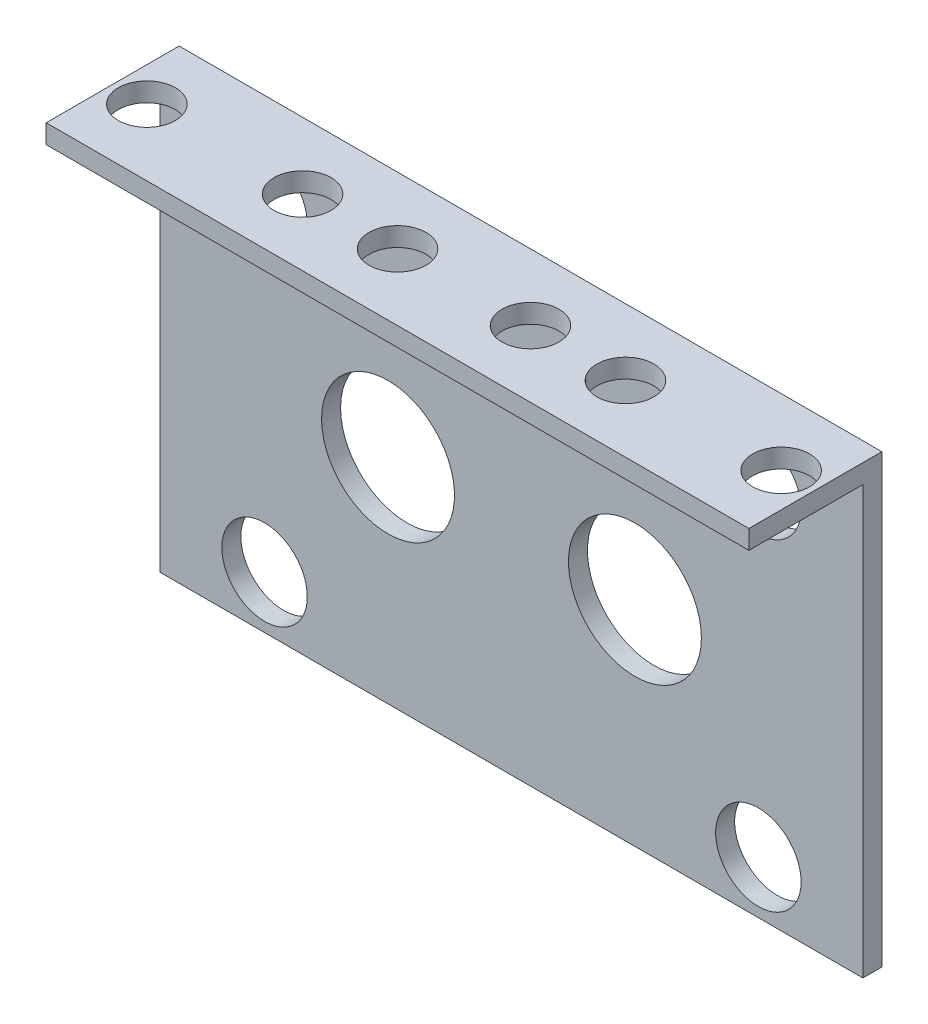
ISO-10303-21;
HEADER;
FILE_DESCRIPTION(('STEP AP214'),'2;1');
FILE_NAME('part.step','',(''),(''),'','','');
FILE_SCHEMA(('AUTOMOTIVE_DESIGN { 1 0 10303 214 1 1 1 1 }'));
ENDSEC;
DATA;
#1=APPLICATION_CONTEXT('core data for automotive mechanical design processes');
#2=APPLICATION_PROTOCOL_DEFINITION('international standard','automotive_design',2000,#1);
#3=PRODUCT_CONTEXT('',#1,'mechanical');
#4=PRODUCT('Part','Part','',(#3));
#5=PRODUCT_RELATED_PRODUCT_CATEGORY('part','',(#4));
#6=PRODUCT_DEFINITION_FORMATION('','',#4);
#7=PRODUCT_DEFINITION_CONTEXT('part definition',#1,'design');
#8=PRODUCT_DEFINITION('design','',#6,#7);
#9=PRODUCT_DEFINITION_SHAPE('','',#8);
#10=(LENGTH_UNIT() NAMED_UNIT(*) SI_UNIT(.MILLI.,.METRE.));
#11=(NAMED_UNIT(*) PLANE_ANGLE_UNIT() SI_UNIT($,.RADIAN.));
#12=(NAMED_UNIT(*) SI_UNIT($,.STERADIAN.) SOLID_ANGLE_UNIT());
#13=UNCERTAINTY_MEASURE_WITH_UNIT(LENGTH_MEASURE(1.E-05),#10,'distance_accuracy_value','');
#14=(GEOMETRIC_REPRESENTATION_CONTEXT(3) GLOBAL_UNCERTAINTY_ASSIGNED_CONTEXT((#13)) GLOBAL_UNIT_ASSIGNED_CONTEXT((#10,
#11,#12)) REPRESENTATION_CONTEXT('',''));
#15=CARTESIAN_POINT('',(0.,0.,0.));
#16=DIRECTION('',(0.,0.,1.));
#17=DIRECTION('',(1.,0.,0.));
#18=AXIS2_PLACEMENT_3D('',#15,#16,#17);
#19=CARTESIAN_POINT('',(0.,0.,1.));
#20=DIRECTION('',(1.,0.,0.));
#21=DIRECTION('',(0.,0.,-1.));
#22=AXIS2_PLACEMENT_3D('',#19,#20,#21);
#23=PLANE('',#22);
#24=DIRECTION('',(0.,-1.,0.));
#25=VECTOR('',#24,1.);
#26=CARTESIAN_POINT('',(0.,0.,0.));
#27=LINE('',#26,#25);
#28=CARTESIAN_POINT('',(0.,23.5,0.));
#29=VERTEX_POINT('',#28);
#30=CARTESIAN_POINT('',(0.,0.,0.));
#31=VERTEX_POINT('',#30);
#32=EDGE_CURVE('E94',#29,#31,#27,.T.);
#33=ORIENTED_EDGE('',*,*,#32,.T.);
#34=DIRECTION('',(0.,0.,-1.));
#35=VECTOR('',#34,1.);
#36=CARTESIAN_POINT('',(0.,0.,1.));
#37=LINE('',#36,#35);
#38=CARTESIAN_POINT('',(0.,0.,1.));
#39=VERTEX_POINT('',#38);
#40=EDGE_CURVE('E11',#39,#31,#37,.T.);
#41=ORIENTED_EDGE('',*,*,#40,.F.);
#42=DIRECTION('',(0.,-1.,0.));
#43=VECTOR('',#42,1.);
#44=CARTESIAN_POINT('',(0.,0.,1.));
#45=LINE('',#44,#43);
#46=CARTESIAN_POINT('',(0.,22.5,1.));
#47=VERTEX_POINT('',#46);
#48=EDGE_CURVE('E86',#47,#39,#45,.T.);
#49=ORIENTED_EDGE('',*,*,#48,.F.);
#50=DIRECTION('',(0.,0.,1.));
#51=VECTOR('',#50,1.);
#52=CARTESIAN_POINT('',(0.,22.5,0.));
#53=LINE('',#52,#51);
#54=CARTESIAN_POINT('',(0.,22.5,7.));
#55=VERTEX_POINT('',#54);
#56=EDGE_CURVE('E49',#47,#55,#53,.T.);
#57=ORIENTED_EDGE('',*,*,#56,.T.);
#58=DIRECTION('',(0.,-1.,0.));
#59=VECTOR('',#58,1.);
#60=CARTESIAN_POINT('',(0.,23.5,7.));
#61=LINE('',#60,#59);
#62=CARTESIAN_POINT('',(0.,23.5,7.));
#63=VERTEX_POINT('',#62);
#64=EDGE_CURVE('E119',#63,#55,#61,.T.);
#65=ORIENTED_EDGE('',*,*,#64,.F.);
#66=DIRECTION('',(0.,0.,1.));
#67=VECTOR('',#66,1.);
#68=CARTESIAN_POINT('',(0.,23.5,0.));
#69=LINE('',#68,#67);
#70=EDGE_CURVE('E97',#29,#63,#69,.T.);
#71=ORIENTED_EDGE('',*,*,#70,.F.);
#72=EDGE_LOOP('',(#33,#41,#49,#57,#65,#71));
#73=FACE_BOUND('',#72,.T.);
#74=ADVANCED_FACE('F33',(#73),#23,.F.);
#75=CARTESIAN_POINT('',(0.,0.,1.));
#76=DIRECTION('',(0.,1.,0.));
#77=DIRECTION('',(0.,0.,1.));
#78=AXIS2_PLACEMENT_3D('',#75,#76,#77);
#79=PLANE('',#78);
#80=DIRECTION('',(1.,0.,0.));
#81=VECTOR('',#80,1.);
#82=CARTESIAN_POINT('',(0.,0.,0.));
#83=LINE('',#82,#81);
#84=CARTESIAN_POINT('',(37.,0.,0.));
#85=VERTEX_POINT('',#84);
#86=EDGE_CURVE('E62',#31,#85,#83,.T.);
#87=ORIENTED_EDGE('',*,*,#86,.T.);
#88=DIRECTION('',(0.,0.,-1.));
#89=VECTOR('',#88,1.);
#90=CARTESIAN_POINT('',(37.,0.,1.));
#91=LINE('',#90,#89);
#92=CARTESIAN_POINT('',(37.,0.,1.));
#93=VERTEX_POINT('',#92);
#94=EDGE_CURVE('E41',#93,#85,#91,.T.);
#95=ORIENTED_EDGE('',*,*,#94,.F.);
#96=DIRECTION('',(1.,0.,0.));
#97=VECTOR('',#96,1.);
#98=CARTESIAN_POINT('',(0.,0.,1.));
#99=LINE('',#98,#97);
#100=EDGE_CURVE('E76',#39,#93,#99,.T.);
#101=ORIENTED_EDGE('',*,*,#100,.F.);
#102=ORIENTED_EDGE('',*,*,#40,.T.);
#103=EDGE_LOOP('',(#87,#95,#101,#102));
#104=FACE_BOUND('',#103,.T.);
#105=ADVANCED_FACE('F78',(#104),#79,.F.);
#106=CARTESIAN_POINT('',(37.,0.,1.));
#107=DIRECTION('',(-1.,0.,0.));
#108=DIRECTION('',(0.,0.,1.));
#109=AXIS2_PLACEMENT_3D('',#106,#107,#108);
#110=PLANE('',#109);
#111=DIRECTION('',(0.,1.,0.));
#112=VECTOR('',#111,1.);
#113=CARTESIAN_POINT('',(37.,0.,0.));
#114=LINE('',#113,#112);
#115=CARTESIAN_POINT('',(37.,23.5,0.));
#116=VERTEX_POINT('',#115);
#117=EDGE_CURVE('E91',#85,#116,#114,.T.);
#118=ORIENTED_EDGE('',*,*,#117,.T.);
#119=DIRECTION('',(0.,0.,-1.));
#120=VECTOR('',#119,1.);
#121=CARTESIAN_POINT('',(37.,23.5,0.));
#122=LINE('',#121,#120);
#123=CARTESIAN_POINT('',(37.,23.5,7.));
#124=VERTEX_POINT('',#123);
#125=EDGE_CURVE('E159',#124,#116,#122,.T.);
#126=ORIENTED_EDGE('',*,*,#125,.F.);
#127=DIRECTION('',(0.,-1.,0.));
#128=VECTOR('',#127,1.);
#129=CARTESIAN_POINT('',(37.,23.5,7.));
#130=LINE('',#129,#128);
#131=CARTESIAN_POINT('',(37.,22.5,7.));
#132=VERTEX_POINT('',#131);
#133=EDGE_CURVE('E147',#124,#132,#130,.T.);
#134=ORIENTED_EDGE('',*,*,#133,.T.);
#135=DIRECTION('',(0.,0.,-1.));
#136=VECTOR('',#135,1.);
#137=CARTESIAN_POINT('',(37.,22.5,0.));
#138=LINE('',#137,#136);
#139=CARTESIAN_POINT('',(37.,22.5,1.));
#140=VERTEX_POINT('',#139);
#141=EDGE_CURVE('E151',#132,#140,#138,.T.);
#142=ORIENTED_EDGE('',*,*,#141,.T.);
#143=DIRECTION('',(0.,1.,0.));
#144=VECTOR('',#143,1.);
#145=CARTESIAN_POINT('',(37.,0.,1.));
#146=LINE('',#145,#144);
#147=EDGE_CURVE('E85',#93,#140,#146,.T.);
#148=ORIENTED_EDGE('',*,*,#147,.F.);
#149=ORIENTED_EDGE('',*,*,#94,.T.);
#150=EDGE_LOOP('',(#118,#126,#134,#142,#148,#149));
#151=FACE_BOUND('',#150,.T.);
#152=ADVANCED_FACE('F237',(#151),#110,.F.);
#153=CARTESIAN_POINT('',(0.,0.,1.));
#154=DIRECTION('',(0.,0.,-1.));
#155=DIRECTION('',(-1.,0.,0.));
#156=AXIS2_PLACEMENT_3D('',#153,#154,#155);
#157=PLANE('',#156);
#158=CARTESIAN_POINT('',(31.5,19.74,1.));
#159=DIRECTION('',(0.,0.,1.));
#160=DIRECTION('',(-1.,0.,0.));
#161=AXIS2_PLACEMENT_3D('',#158,#159,#160);
#162=CIRCLE('',#161,2.25);
#163=CARTESIAN_POINT('',(29.25,19.74,1.));
#164=VERTEX_POINT('',#163);
#165=EDGE_CURVE('E115',#164,#164,#162,.T.);
#166=ORIENTED_EDGE('',*,*,#165,.F.);
#167=EDGE_LOOP('',(#166));
#168=FACE_BOUND('',#167,.T.);
#169=CARTESIAN_POINT('',(25.,11.25,1.));
#170=DIRECTION('',(0.,0.,1.));
#171=DIRECTION('',(1.,0.,0.));
#172=AXIS2_PLACEMENT_3D('',#169,#170,#171);
#173=CIRCLE('',#172,3.5);
#174=CARTESIAN_POINT('',(28.5,11.25,1.));
#175=VERTEX_POINT('',#174);
#176=EDGE_CURVE('E130',#175,#175,#173,.T.);
#177=ORIENTED_EDGE('',*,*,#176,.F.);
#178=EDGE_LOOP('',(#177));
#179=FACE_BOUND('',#178,.T.);
#180=CARTESIAN_POINT('',(5.49999999999999,2.76,1.));
#181=DIRECTION('',(0.,0.,1.));
#182=DIRECTION('',(-1.,0.,0.));
#183=AXIS2_PLACEMENT_3D('',#180,#181,#182);
#184=CIRCLE('',#183,2.25);
#185=CARTESIAN_POINT('',(3.24999999999999,2.76,1.));
#186=VERTEX_POINT('',#185);
#187=EDGE_CURVE('E123',#186,#186,#184,.T.);
#188=ORIENTED_EDGE('',*,*,#187,.F.);
#189=EDGE_LOOP('',(#188));
#190=FACE_BOUND('',#189,.T.);
#191=CARTESIAN_POINT('',(12.,11.25,1.));
#192=DIRECTION('',(0.,0.,1.));
#193=DIRECTION('',(-1.,0.,0.));
#194=AXIS2_PLACEMENT_3D('',#191,#192,#193);
#195=CIRCLE('',#194,3.5);
#196=CARTESIAN_POINT('',(8.5,11.25,1.));
#197=VERTEX_POINT('',#196);
#198=EDGE_CURVE('E140',#197,#197,#195,.T.);
#199=ORIENTED_EDGE('',*,*,#198,.F.);
#200=EDGE_LOOP('',(#199));
#201=FACE_BOUND('',#200,.T.);
#202=CARTESIAN_POINT('',(31.5,2.76000000000002,1.));
#203=DIRECTION('',(0.,0.,1.));
#204=DIRECTION('',(1.,0.,0.));
#205=AXIS2_PLACEMENT_3D('',#202,#203,#204);
#206=CIRCLE('',#205,2.25000000000001);
#207=CARTESIAN_POINT('',(33.75,2.76000000000002,1.));
#208=VERTEX_POINT('',#207);
#209=EDGE_CURVE('E122',#208,#208,#206,.T.);
#210=ORIENTED_EDGE('',*,*,#209,.F.);
#211=EDGE_LOOP('',(#210));
#212=FACE_BOUND('',#211,.T.);
#213=CARTESIAN_POINT('',(5.5,19.74,1.));
#214=DIRECTION('',(0.,0.,1.));
#215=DIRECTION('',(1.,0.,0.));
#216=AXIS2_PLACEMENT_3D('',#213,#214,#215);
#217=CIRCLE('',#216,2.25);
#218=CARTESIAN_POINT('',(7.75,19.74,1.));
#219=VERTEX_POINT('',#218);
#220=EDGE_CURVE('E104',#219,#219,#217,.T.);
#221=ORIENTED_EDGE('',*,*,#220,.F.);
#222=EDGE_LOOP('',(#221));
#223=FACE_BOUND('',#222,.T.);
#224=ORIENTED_EDGE('',*,*,#48,.T.);
#225=ORIENTED_EDGE('',*,*,#100,.T.);
#226=ORIENTED_EDGE('',*,*,#147,.T.);
#227=DIRECTION('',(-1.,0.,0.));
#228=VECTOR('',#227,1.);
#229=CARTESIAN_POINT('',(0.,22.5,1.));
#230=LINE('',#229,#228);
#231=EDGE_CURVE('E66',#140,#47,#230,.T.);
#232=ORIENTED_EDGE('',*,*,#231,.T.);
#233=EDGE_LOOP('',(#224,#225,#226,#232));
#234=FACE_BOUND('',#233,.T.);
#235=ADVANCED_FACE('F89',(#168,#179,#190,#201,#212,#223,#234),#157,.F.);
#236=CARTESIAN_POINT('',(0.,0.,0.));
#237=DIRECTION('',(0.,0.,-1.));
#238=DIRECTION('',(-1.,0.,0.));
#239=AXIS2_PLACEMENT_3D('',#236,#237,#238);
#240=PLANE('',#239);
#241=CARTESIAN_POINT('',(31.5,19.74,0.));
#242=DIRECTION('',(0.,0.,1.));
#243=DIRECTION('',(-1.,0.,0.));
#244=AXIS2_PLACEMENT_3D('',#241,#242,#243);
#245=CIRCLE('',#244,2.25);
#246=CARTESIAN_POINT('',(29.25,19.74,0.));
#247=VERTEX_POINT('',#246);
#248=EDGE_CURVE('E118',#247,#247,#245,.T.);
#249=ORIENTED_EDGE('',*,*,#248,.T.);
#250=EDGE_LOOP('',(#249));
#251=FACE_BOUND('',#250,.T.);
#252=CARTESIAN_POINT('',(25.,11.25,0.));
#253=DIRECTION('',(0.,0.,1.));
#254=DIRECTION('',(1.,0.,0.));
#255=AXIS2_PLACEMENT_3D('',#252,#253,#254);
#256=CIRCLE('',#255,3.5);
#257=CARTESIAN_POINT('',(28.5,11.25,0.));
#258=VERTEX_POINT('',#257);
#259=EDGE_CURVE('E113',#258,#258,#256,.T.);
#260=ORIENTED_EDGE('',*,*,#259,.T.);
#261=EDGE_LOOP('',(#260));
#262=FACE_BOUND('',#261,.T.);
#263=CARTESIAN_POINT('',(5.49999999999999,2.76,0.));
#264=DIRECTION('',(0.,0.,1.));
#265=DIRECTION('',(-1.,0.,0.));
#266=AXIS2_PLACEMENT_3D('',#263,#264,#265);
#267=CIRCLE('',#266,2.25);
#268=CARTESIAN_POINT('',(3.24999999999999,2.76,0.));
#269=VERTEX_POINT('',#268);
#270=EDGE_CURVE('E126',#269,#269,#267,.T.);
#271=ORIENTED_EDGE('',*,*,#270,.T.);
#272=EDGE_LOOP('',(#271));
#273=FACE_BOUND('',#272,.T.);
#274=CARTESIAN_POINT('',(12.,11.25,0.));
#275=DIRECTION('',(0.,0.,1.));
#276=DIRECTION('',(-1.,0.,0.));
#277=AXIS2_PLACEMENT_3D('',#274,#275,#276);
#278=CIRCLE('',#277,3.5);
#279=CARTESIAN_POINT('',(8.5,11.25,0.));
#280=VERTEX_POINT('',#279);
#281=EDGE_CURVE('E127',#280,#280,#278,.T.);
#282=ORIENTED_EDGE('',*,*,#281,.T.);
#283=EDGE_LOOP('',(#282));
#284=FACE_BOUND('',#283,.T.);
#285=CARTESIAN_POINT('',(31.5,2.76000000000002,0.));
#286=DIRECTION('',(0.,0.,1.));
#287=DIRECTION('',(1.,0.,0.));
#288=AXIS2_PLACEMENT_3D('',#285,#286,#287);
#289=CIRCLE('',#288,2.25000000000001);
#290=CARTESIAN_POINT('',(33.75,2.76000000000002,0.));
#291=VERTEX_POINT('',#290);
#292=EDGE_CURVE('E137',#291,#291,#289,.T.);
#293=ORIENTED_EDGE('',*,*,#292,.T.);
#294=EDGE_LOOP('',(#293));
#295=FACE_BOUND('',#294,.T.);
#296=CARTESIAN_POINT('',(5.5,19.74,0.));
#297=DIRECTION('',(0.,0.,1.));
#298=DIRECTION('',(1.,0.,0.));
#299=AXIS2_PLACEMENT_3D('',#296,#297,#298);
#300=CIRCLE('',#299,2.25);
#301=CARTESIAN_POINT('',(7.75,19.74,0.));
#302=VERTEX_POINT('',#301);
#303=EDGE_CURVE('E100',#302,#302,#300,.T.);
#304=ORIENTED_EDGE('',*,*,#303,.T.);
#305=EDGE_LOOP('',(#304));
#306=FACE_BOUND('',#305,.T.);
#307=ORIENTED_EDGE('',*,*,#32,.F.);
#308=DIRECTION('',(-1.,0.,0.));
#309=VECTOR('',#308,1.);
#310=CARTESIAN_POINT('',(0.,23.5,0.));
#311=LINE('',#310,#309);
#312=EDGE_CURVE('E150',#116,#29,#311,.T.);
#313=ORIENTED_EDGE('',*,*,#312,.F.);
#314=ORIENTED_EDGE('',*,*,#117,.F.);
#315=ORIENTED_EDGE('',*,*,#86,.F.);
#316=EDGE_LOOP('',(#307,#313,#314,#315));
#317=FACE_BOUND('',#316,.T.);
#318=ADVANCED_FACE('F238',(#251,#262,#273,#284,#295,#306,#317),#240,.T.);
#319=CARTESIAN_POINT('',(5.5,19.74,0.));
#320=DIRECTION('',(0.,0.,1.));
#321=DIRECTION('',(1.,0.,0.));
#322=AXIS2_PLACEMENT_3D('',#319,#320,#321);
#323=CYLINDRICAL_SURFACE('',#322,2.25);
#324=ORIENTED_EDGE('',*,*,#303,.F.);
#325=EDGE_LOOP('',(#324));
#326=FACE_BOUND('',#325,.T.);
#327=ORIENTED_EDGE('',*,*,#220,.T.);
#328=EDGE_LOOP('',(#327));
#329=FACE_BOUND('',#328,.T.);
#330=ADVANCED_FACE('F240',(#326,#329),#323,.F.);
#331=CARTESIAN_POINT('',(31.5,2.76000000000002,0.));
#332=DIRECTION('',(0.,0.,1.));
#333=DIRECTION('',(1.,0.,0.));
#334=AXIS2_PLACEMENT_3D('',#331,#332,#333);
#335=CYLINDRICAL_SURFACE('',#334,2.25000000000001);
#336=ORIENTED_EDGE('',*,*,#292,.F.);
#337=EDGE_LOOP('',(#336));
#338=FACE_BOUND('',#337,.T.);
#339=ORIENTED_EDGE('',*,*,#209,.T.);
#340=EDGE_LOOP('',(#339));
#341=FACE_BOUND('',#340,.T.);
#342=ADVANCED_FACE('F247',(#338,#341),#335,.F.);
#343=CARTESIAN_POINT('',(12.,11.25,0.));
#344=DIRECTION('',(0.,0.,1.));
#345=DIRECTION('',(1.,0.,0.));
#346=AXIS2_PLACEMENT_3D('',#343,#344,#345);
#347=CYLINDRICAL_SURFACE('',#346,3.5);
#348=ORIENTED_EDGE('',*,*,#281,.F.);
#349=EDGE_LOOP('',(#348));
#350=FACE_BOUND('',#349,.T.);
#351=ORIENTED_EDGE('',*,*,#198,.T.);
#352=EDGE_LOOP('',(#351));
#353=FACE_BOUND('',#352,.T.);
#354=ADVANCED_FACE('F359',(#350,#353),#347,.F.);
#355=CARTESIAN_POINT('',(5.49999999999999,2.76,0.));
#356=DIRECTION('',(0.,0.,1.));
#357=DIRECTION('',(1.,0.,0.));
#358=AXIS2_PLACEMENT_3D('',#355,#356,#357);
#359=CYLINDRICAL_SURFACE('',#358,2.25);
#360=ORIENTED_EDGE('',*,*,#270,.F.);
#361=EDGE_LOOP('',(#360));
#362=FACE_BOUND('',#361,.T.);
#363=ORIENTED_EDGE('',*,*,#187,.T.);
#364=EDGE_LOOP('',(#363));
#365=FACE_BOUND('',#364,.T.);
#366=ADVANCED_FACE('F362',(#362,#365),#359,.F.);
#367=CARTESIAN_POINT('',(25.,11.25,0.));
#368=DIRECTION('',(0.,0.,1.));
#369=DIRECTION('',(1.,0.,0.));
#370=AXIS2_PLACEMENT_3D('',#367,#368,#369);
#371=CYLINDRICAL_SURFACE('',#370,3.5);
#372=ORIENTED_EDGE('',*,*,#259,.F.);
#373=EDGE_LOOP('',(#372));
#374=FACE_BOUND('',#373,.T.);
#375=ORIENTED_EDGE('',*,*,#176,.T.);
#376=EDGE_LOOP('',(#375));
#377=FACE_BOUND('',#376,.T.);
#378=ADVANCED_FACE('F367',(#374,#377),#371,.F.);
#379=CARTESIAN_POINT('',(31.5,19.74,0.));
#380=DIRECTION('',(0.,0.,1.));
#381=DIRECTION('',(1.,0.,0.));
#382=AXIS2_PLACEMENT_3D('',#379,#380,#381);
#383=CYLINDRICAL_SURFACE('',#382,2.25);
#384=ORIENTED_EDGE('',*,*,#248,.F.);
#385=EDGE_LOOP('',(#384));
#386=FACE_BOUND('',#385,.T.);
#387=ORIENTED_EDGE('',*,*,#165,.T.);
#388=EDGE_LOOP('',(#387));
#389=FACE_BOUND('',#388,.T.);
#390=ADVANCED_FACE('F282',(#386,#389),#383,.F.);
#391=CARTESIAN_POINT('',(0.,23.5,7.));
#392=DIRECTION('',(0.,0.,-1.));
#393=DIRECTION('',(-1.,0.,0.));
#394=AXIS2_PLACEMENT_3D('',#391,#392,#393);
#395=PLANE('',#394);
#396=DIRECTION('',(1.,0.,0.));
#397=VECTOR('',#396,1.);
#398=CARTESIAN_POINT('',(0.,22.5,7.));
#399=LINE('',#398,#397);
#400=EDGE_CURVE('E153',#55,#132,#399,.T.);
#401=ORIENTED_EDGE('',*,*,#400,.T.);
#402=ORIENTED_EDGE('',*,*,#133,.F.);
#403=DIRECTION('',(1.,0.,0.));
#404=VECTOR('',#403,1.);
#405=CARTESIAN_POINT('',(0.,23.5,7.));
#406=LINE('',#405,#404);
#407=EDGE_CURVE('E162',#63,#124,#406,.T.);
#408=ORIENTED_EDGE('',*,*,#407,.F.);
#409=ORIENTED_EDGE('',*,*,#64,.T.);
#410=EDGE_LOOP('',(#401,#402,#408,#409));
#411=FACE_BOUND('',#410,.T.);
#412=ADVANCED_FACE('F215',(#411),#395,.F.);
#413=CARTESIAN_POINT('',(0.,23.5,0.));
#414=DIRECTION('',(0.,1.,0.));
#415=DIRECTION('',(0.,0.,1.));
#416=AXIS2_PLACEMENT_3D('',#413,#414,#415);
#417=PLANE('',#416);
#418=CARTESIAN_POINT('',(1.8,23.5,3.5));
#419=DIRECTION('',(0.,1.,0.));
#420=DIRECTION('',(0.,0.,1.));
#421=AXIS2_PLACEMENT_3D('',#418,#419,#420);
#422=CIRCLE('',#421,1.5);
#423=CARTESIAN_POINT('',(1.8,23.5,5.));
#424=VERTEX_POINT('',#423);
#425=EDGE_CURVE('E196',#424,#424,#422,.T.);
#426=ORIENTED_EDGE('',*,*,#425,.F.);
#427=EDGE_LOOP('',(#426));
#428=FACE_BOUND('',#427,.T.);
#429=CARTESIAN_POINT('',(10.,23.5,3.5));
#430=DIRECTION('',(0.,1.,0.));
#431=DIRECTION('',(0.,0.,1.));
#432=AXIS2_PLACEMENT_3D('',#429,#430,#431);
#433=CIRCLE('',#432,1.5);
#434=CARTESIAN_POINT('',(10.,23.5,5.));
#435=VERTEX_POINT('',#434);
#436=EDGE_CURVE('E190',#435,#435,#433,.T.);
#437=ORIENTED_EDGE('',*,*,#436,.F.);
#438=EDGE_LOOP('',(#437));
#439=FACE_BOUND('',#438,.T.);
#440=CARTESIAN_POINT('',(15.,23.5,3.5));
#441=DIRECTION('',(0.,1.,0.));
#442=DIRECTION('',(0.,0.,1.));
#443=AXIS2_PLACEMENT_3D('',#440,#441,#442);
#444=CIRCLE('',#443,1.5);
#445=CARTESIAN_POINT('',(15.,23.5,5.));
#446=VERTEX_POINT('',#445);
#447=EDGE_CURVE('E184',#446,#446,#444,.T.);
#448=ORIENTED_EDGE('',*,*,#447,.F.);
#449=EDGE_LOOP('',(#448));
#450=FACE_BOUND('',#449,.T.);
#451=CARTESIAN_POINT('',(22.,23.5,3.5));
#452=DIRECTION('',(0.,1.,0.));
#453=DIRECTION('',(0.,0.,1.));
#454=AXIS2_PLACEMENT_3D('',#451,#452,#453);
#455=CIRCLE('',#454,1.5);
#456=CARTESIAN_POINT('',(22.,23.5,5.));
#457=VERTEX_POINT('',#456);
#458=EDGE_CURVE('E178',#457,#457,#455,.T.);
#459=ORIENTED_EDGE('',*,*,#458,.F.);
#460=EDGE_LOOP('',(#459));
#461=FACE_BOUND('',#460,.T.);
#462=CARTESIAN_POINT('',(27.,23.5,3.5));
#463=DIRECTION('',(0.,1.,0.));
#464=DIRECTION('',(0.,0.,1.));
#465=AXIS2_PLACEMENT_3D('',#462,#463,#464);
#466=CIRCLE('',#465,1.5);
#467=CARTESIAN_POINT('',(27.,23.5,5.));
#468=VERTEX_POINT('',#467);
#469=EDGE_CURVE('E172',#468,#468,#466,.T.);
#470=ORIENTED_EDGE('',*,*,#469,.F.);
#471=EDGE_LOOP('',(#470));
#472=FACE_BOUND('',#471,.T.);
#473=CARTESIAN_POINT('',(35.2,23.5,3.5));
#474=DIRECTION('',(0.,1.,0.));
#475=DIRECTION('',(0.,0.,1.));
#476=AXIS2_PLACEMENT_3D('',#473,#474,#475);
#477=CIRCLE('',#476,1.5);
#478=CARTESIAN_POINT('',(35.2,23.5,5.));
#479=VERTEX_POINT('',#478);
#480=EDGE_CURVE('E166',#479,#479,#477,.T.);
#481=ORIENTED_EDGE('',*,*,#480,.F.);
#482=EDGE_LOOP('',(#481));
#483=FACE_BOUND('',#482,.T.);
#484=ORIENTED_EDGE('',*,*,#70,.T.);
#485=ORIENTED_EDGE('',*,*,#407,.T.);
#486=ORIENTED_EDGE('',*,*,#125,.T.);
#487=ORIENTED_EDGE('',*,*,#312,.T.);
#488=EDGE_LOOP('',(#484,#485,#486,#487));
#489=FACE_BOUND('',#488,.T.);
#490=ADVANCED_FACE('F212',(#428,#439,#450,#461,#472,#483,#489),#417,.T.);
#491=CARTESIAN_POINT('',(0.,22.5,0.));
#492=DIRECTION('',(0.,1.,0.));
#493=DIRECTION('',(0.,0.,1.));
#494=AXIS2_PLACEMENT_3D('',#491,#492,#493);
#495=PLANE('',#494);
#496=CARTESIAN_POINT('',(1.8,22.5,3.5));
#497=DIRECTION('',(0.,1.,0.));
#498=DIRECTION('',(0.,0.,1.));
#499=AXIS2_PLACEMENT_3D('',#496,#497,#498);
#500=CIRCLE('',#499,1.5);
#501=CARTESIAN_POINT('',(1.8,22.5,5.));
#502=VERTEX_POINT('',#501);
#503=EDGE_CURVE('E157',#502,#502,#500,.T.);
#504=ORIENTED_EDGE('',*,*,#503,.T.);
#505=EDGE_LOOP('',(#504));
#506=FACE_BOUND('',#505,.T.);
#507=CARTESIAN_POINT('',(10.,22.5,3.5));
#508=DIRECTION('',(0.,1.,0.));
#509=DIRECTION('',(0.,0.,1.));
#510=AXIS2_PLACEMENT_3D('',#507,#508,#509);
#511=CIRCLE('',#510,1.5);
#512=CARTESIAN_POINT('',(10.,22.5,5.));
#513=VERTEX_POINT('',#512);
#514=EDGE_CURVE('E193',#513,#513,#511,.T.);
#515=ORIENTED_EDGE('',*,*,#514,.T.);
#516=EDGE_LOOP('',(#515));
#517=FACE_BOUND('',#516,.T.);
#518=CARTESIAN_POINT('',(15.,22.5,3.5));
#519=DIRECTION('',(0.,1.,0.));
#520=DIRECTION('',(0.,0.,1.));
#521=AXIS2_PLACEMENT_3D('',#518,#519,#520);
#522=CIRCLE('',#521,1.5);
#523=CARTESIAN_POINT('',(15.,22.5,5.));
#524=VERTEX_POINT('',#523);
#525=EDGE_CURVE('E187',#524,#524,#522,.T.);
#526=ORIENTED_EDGE('',*,*,#525,.T.);
#527=EDGE_LOOP('',(#526));
#528=FACE_BOUND('',#527,.T.);
#529=CARTESIAN_POINT('',(22.,22.5,3.5));
#530=DIRECTION('',(0.,1.,0.));
#531=DIRECTION('',(0.,0.,1.));
#532=AXIS2_PLACEMENT_3D('',#529,#530,#531);
#533=CIRCLE('',#532,1.5);
#534=CARTESIAN_POINT('',(22.,22.5,5.));
#535=VERTEX_POINT('',#534);
#536=EDGE_CURVE('E181',#535,#535,#533,.T.);
#537=ORIENTED_EDGE('',*,*,#536,.T.);
#538=EDGE_LOOP('',(#537));
#539=FACE_BOUND('',#538,.T.);
#540=CARTESIAN_POINT('',(27.,22.5,3.5));
#541=DIRECTION('',(0.,1.,0.));
#542=DIRECTION('',(0.,0.,1.));
#543=AXIS2_PLACEMENT_3D('',#540,#541,#542);
#544=CIRCLE('',#543,1.5);
#545=CARTESIAN_POINT('',(27.,22.5,5.));
#546=VERTEX_POINT('',#545);
#547=EDGE_CURVE('E175',#546,#546,#544,.T.);
#548=ORIENTED_EDGE('',*,*,#547,.T.);
#549=EDGE_LOOP('',(#548));
#550=FACE_BOUND('',#549,.T.);
#551=CARTESIAN_POINT('',(35.2,22.5,3.5));
#552=DIRECTION('',(0.,1.,0.));
#553=DIRECTION('',(0.,0.,1.));
#554=AXIS2_PLACEMENT_3D('',#551,#552,#553);
#555=CIRCLE('',#554,1.5);
#556=CARTESIAN_POINT('',(35.2,22.5,5.));
#557=VERTEX_POINT('',#556);
#558=EDGE_CURVE('E169',#557,#557,#555,.T.);
#559=ORIENTED_EDGE('',*,*,#558,.T.);
#560=EDGE_LOOP('',(#559));
#561=FACE_BOUND('',#560,.T.);
#562=ORIENTED_EDGE('',*,*,#231,.F.);
#563=ORIENTED_EDGE('',*,*,#141,.F.);
#564=ORIENTED_EDGE('',*,*,#400,.F.);
#565=ORIENTED_EDGE('',*,*,#56,.F.);
#566=EDGE_LOOP('',(#562,#563,#564,#565));
#567=FACE_BOUND('',#566,.T.);
#568=ADVANCED_FACE('F202',(#506,#517,#528,#539,#550,#561,#567),#495,.F.);
#569=CARTESIAN_POINT('',(35.2,22.5,3.5));
#570=DIRECTION('',(0.,1.,0.));
#571=DIRECTION('',(0.,0.,1.));
#572=AXIS2_PLACEMENT_3D('',#569,#570,#571);
#573=CYLINDRICAL_SURFACE('',#572,1.5);
#574=ORIENTED_EDGE('',*,*,#558,.F.);
#575=EDGE_LOOP('',(#574));
#576=FACE_BOUND('',#575,.T.);
#577=ORIENTED_EDGE('',*,*,#480,.T.);
#578=EDGE_LOOP('',(#577));
#579=FACE_BOUND('',#578,.T.);
#580=ADVANCED_FACE('F298',(#576,#579),#573,.F.);
#581=CARTESIAN_POINT('',(27.,22.5,3.5));
#582=DIRECTION('',(0.,1.,0.));
#583=DIRECTION('',(0.,0.,1.));
#584=AXIS2_PLACEMENT_3D('',#581,#582,#583);
#585=CYLINDRICAL_SURFACE('',#584,1.5);
#586=ORIENTED_EDGE('',*,*,#547,.F.);
#587=EDGE_LOOP('',(#586));
#588=FACE_BOUND('',#587,.T.);
#589=ORIENTED_EDGE('',*,*,#469,.T.);
#590=EDGE_LOOP('',(#589));
#591=FACE_BOUND('',#590,.T.);
#592=ADVANCED_FACE('F307',(#588,#591),#585,.F.);
#593=CARTESIAN_POINT('',(22.,22.5,3.5));
#594=DIRECTION('',(0.,1.,0.));
#595=DIRECTION('',(0.,0.,1.));
#596=AXIS2_PLACEMENT_3D('',#593,#594,#595);
#597=CYLINDRICAL_SURFACE('',#596,1.5);
#598=ORIENTED_EDGE('',*,*,#536,.F.);
#599=EDGE_LOOP('',(#598));
#600=FACE_BOUND('',#599,.T.);
#601=ORIENTED_EDGE('',*,*,#458,.T.);
#602=EDGE_LOOP('',(#601));
#603=FACE_BOUND('',#602,.T.);
#604=ADVANCED_FACE('F317',(#600,#603),#597,.F.);
#605=CARTESIAN_POINT('',(15.,22.5,3.5));
#606=DIRECTION('',(0.,1.,0.));
#607=DIRECTION('',(0.,0.,1.));
#608=AXIS2_PLACEMENT_3D('',#605,#606,#607);
#609=CYLINDRICAL_SURFACE('',#608,1.5);
#610=ORIENTED_EDGE('',*,*,#525,.F.);
#611=EDGE_LOOP('',(#610));
#612=FACE_BOUND('',#611,.T.);
#613=ORIENTED_EDGE('',*,*,#447,.T.);
#614=EDGE_LOOP('',(#613));
#615=FACE_BOUND('',#614,.T.);
#616=ADVANCED_FACE('F327',(#612,#615),#609,.F.);
#617=CARTESIAN_POINT('',(10.,22.5,3.5));
#618=DIRECTION('',(0.,1.,0.));
#619=DIRECTION('',(0.,0.,1.));
#620=AXIS2_PLACEMENT_3D('',#617,#618,#619);
#621=CYLINDRICAL_SURFACE('',#620,1.5);
#622=ORIENTED_EDGE('',*,*,#514,.F.);
#623=EDGE_LOOP('',(#622));
#624=FACE_BOUND('',#623,.T.);
#625=ORIENTED_EDGE('',*,*,#436,.T.);
#626=EDGE_LOOP('',(#625));
#627=FACE_BOUND('',#626,.T.);
#628=ADVANCED_FACE('F208',(#624,#627),#621,.F.);
#629=CARTESIAN_POINT('',(1.8,22.5,3.5));
#630=DIRECTION('',(0.,1.,0.));
#631=DIRECTION('',(0.,0.,1.));
#632=AXIS2_PLACEMENT_3D('',#629,#630,#631);
#633=CYLINDRICAL_SURFACE('',#632,1.5);
#634=ORIENTED_EDGE('',*,*,#503,.F.);
#635=EDGE_LOOP('',(#634));
#636=FACE_BOUND('',#635,.T.);
#637=ORIENTED_EDGE('',*,*,#425,.T.);
#638=EDGE_LOOP('',(#637));
#639=FACE_BOUND('',#638,.T.);
#640=ADVANCED_FACE('F205',(#636,#639),#633,.F.);
#641=CLOSED_SHELL('',(#74,#105,#152,#235,#318,#330,#342,#354,#366,#378,#390,#412,#490,#568,#580,
#592,#604,#616,#628,#640));
#642=MANIFOLD_SOLID_BREP('B2',#641);
#643=ADVANCED_BREP_SHAPE_REPRESENTATION('',(#18,#642),#14);
#644=SHAPE_DEFINITION_REPRESENTATION(#9,#643);
ENDSEC;
END-ISO-10303-21;
